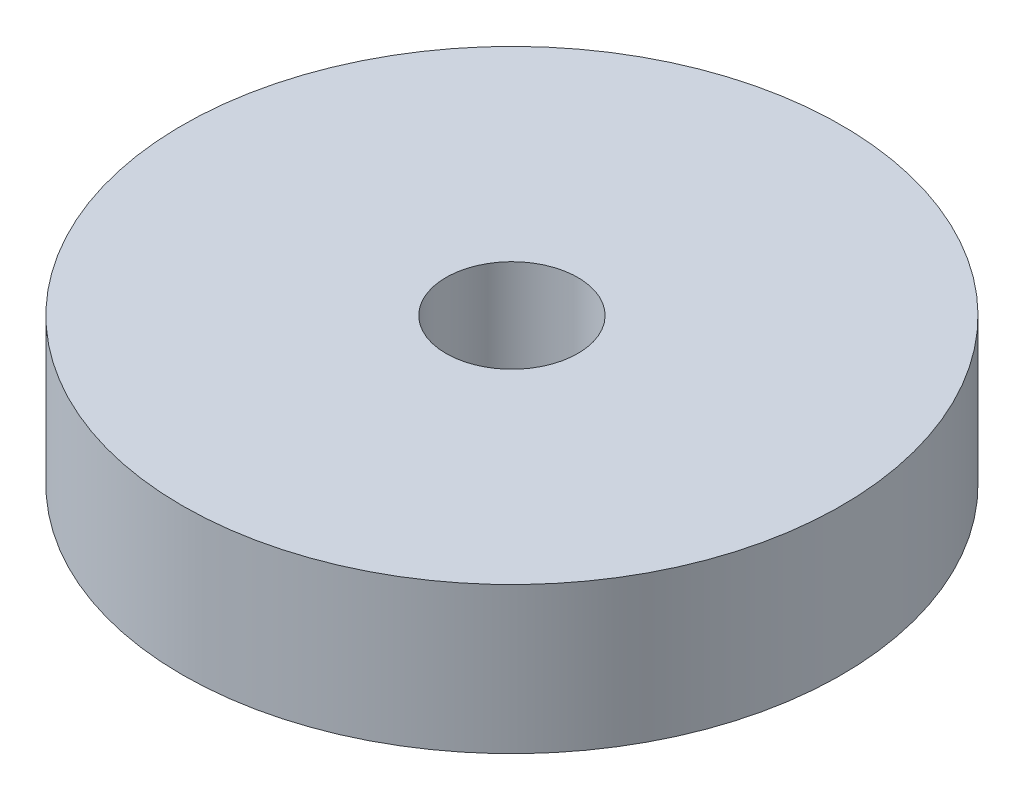
ISO-10303-21;
HEADER;
FILE_DESCRIPTION(('STEP AP214'),'2;1');
FILE_NAME('part.step','',(''),(''),'','','');
FILE_SCHEMA(('AUTOMOTIVE_DESIGN { 1 0 10303 214 1 1 1 1 }'));
ENDSEC;
DATA;
#1=APPLICATION_CONTEXT('core data for automotive mechanical design processes');
#2=APPLICATION_PROTOCOL_DEFINITION('international standard','automotive_design',2000,#1);
#3=PRODUCT_CONTEXT('',#1,'mechanical');
#4=PRODUCT('Part','Part','',(#3));
#5=PRODUCT_RELATED_PRODUCT_CATEGORY('part','',(#4));
#6=PRODUCT_DEFINITION_FORMATION('','',#4);
#7=PRODUCT_DEFINITION_CONTEXT('part definition',#1,'design');
#8=PRODUCT_DEFINITION('design','',#6,#7);
#9=PRODUCT_DEFINITION_SHAPE('','',#8);
#10=(LENGTH_UNIT() NAMED_UNIT(*) SI_UNIT(.MILLI.,.METRE.));
#11=(NAMED_UNIT(*) PLANE_ANGLE_UNIT() SI_UNIT($,.RADIAN.));
#12=(NAMED_UNIT(*) SI_UNIT($,.STERADIAN.) SOLID_ANGLE_UNIT());
#13=UNCERTAINTY_MEASURE_WITH_UNIT(LENGTH_MEASURE(1.E-05),#10,'distance_accuracy_value','');
#14=(GEOMETRIC_REPRESENTATION_CONTEXT(3) GLOBAL_UNCERTAINTY_ASSIGNED_CONTEXT((#13)) GLOBAL_UNIT_ASSIGNED_CONTEXT((#10,
#11,#12)) REPRESENTATION_CONTEXT('',''));
#15=CARTESIAN_POINT('',(0.,0.,0.));
#16=DIRECTION('',(0.,0.,1.));
#17=DIRECTION('',(1.,0.,0.));
#18=AXIS2_PLACEMENT_3D('',#15,#16,#17);
#19=CARTESIAN_POINT('',(78.0519363783236,2.,71.4526734962403));
#20=DIRECTION('',(0.,-1.,0.));
#21=DIRECTION('',(0.,0.,-1.));
#22=AXIS2_PLACEMENT_3D('',#19,#20,#21);
#23=CYLINDRICAL_SURFACE('',#22,4.50000000000001);
#24=CARTESIAN_POINT('',(78.0519363783236,2.,71.4526734962403));
#25=DIRECTION('',(0.,1.,0.));
#26=DIRECTION('',(0.,0.,1.));
#27=AXIS2_PLACEMENT_3D('',#24,#25,#26);
#28=CIRCLE('',#27,4.50000000000001);
#29=CARTESIAN_POINT('',(78.0519363783236,2.,75.9526734962403));
#30=VERTEX_POINT('',#29);
#31=EDGE_CURVE('E12',#30,#30,#28,.T.);
#32=ORIENTED_EDGE('',*,*,#31,.F.);
#33=EDGE_LOOP('',(#32));
#34=FACE_BOUND('',#33,.T.);
#35=CARTESIAN_POINT('',(78.0519363783236,0.,71.4526734962403));
#36=DIRECTION('',(0.,1.,0.));
#37=DIRECTION('',(0.,0.,1.));
#38=AXIS2_PLACEMENT_3D('',#35,#36,#37);
#39=CIRCLE('',#38,4.50000000000001);
#40=CARTESIAN_POINT('',(78.0519363783236,0.,75.9526734962403));
#41=VERTEX_POINT('',#40);
#42=EDGE_CURVE('E47',#41,#41,#39,.T.);
#43=ORIENTED_EDGE('',*,*,#42,.T.);
#44=EDGE_LOOP('',(#43));
#45=FACE_BOUND('',#44,.T.);
#46=ADVANCED_FACE('F44',(#34,#45),#23,.T.);
#47=CARTESIAN_POINT('',(78.0519363783236,2.,71.4526734962403));
#48=DIRECTION('',(0.,1.,0.));
#49=DIRECTION('',(0.,0.,1.));
#50=AXIS2_PLACEMENT_3D('',#47,#48,#49);
#51=PLANE('',#50);
#52=CARTESIAN_POINT('',(78.0519363783236,2.,71.4526734962403));
#53=DIRECTION('',(0.,1.,0.));
#54=DIRECTION('',(0.,0.,1.));
#55=AXIS2_PLACEMENT_3D('',#52,#53,#54);
#56=CIRCLE('',#55,0.900000000000003);
#57=CARTESIAN_POINT('',(78.0519363783236,2.,72.3526734962402));
#58=VERTEX_POINT('',#57);
#59=EDGE_CURVE('E56',#58,#58,#56,.T.);
#60=ORIENTED_EDGE('',*,*,#59,.F.);
#61=EDGE_LOOP('',(#60));
#62=FACE_BOUND('',#61,.T.);
#63=ORIENTED_EDGE('',*,*,#31,.T.);
#64=EDGE_LOOP('',(#63));
#65=FACE_BOUND('',#64,.T.);
#66=ADVANCED_FACE('F71',(#62,#65),#51,.T.);
#67=CARTESIAN_POINT('',(78.0519363783236,0.,71.4526734962403));
#68=DIRECTION('',(0.,1.,0.));
#69=DIRECTION('',(0.,0.,1.));
#70=AXIS2_PLACEMENT_3D('',#67,#68,#69);
#71=PLANE('',#70);
#72=CARTESIAN_POINT('',(78.0519363783236,0.,71.4526734962403));
#73=DIRECTION('',(0.,1.,0.));
#74=DIRECTION('',(0.,0.,1.));
#75=AXIS2_PLACEMENT_3D('',#72,#73,#74);
#76=CIRCLE('',#75,0.900000000000003);
#77=CARTESIAN_POINT('',(78.0519363783236,0.,72.3526734962402));
#78=VERTEX_POINT('',#77);
#79=EDGE_CURVE('E54',#78,#78,#76,.T.);
#80=ORIENTED_EDGE('',*,*,#79,.T.);
#81=EDGE_LOOP('',(#80));
#82=FACE_BOUND('',#81,.T.);
#83=ORIENTED_EDGE('',*,*,#42,.F.);
#84=EDGE_LOOP('',(#83));
#85=FACE_BOUND('',#84,.T.);
#86=ADVANCED_FACE('F62',(#82,#85),#71,.F.);
#87=CARTESIAN_POINT('',(78.0519363783236,0.,71.4526734962403));
#88=DIRECTION('',(0.,1.,0.));
#89=DIRECTION('',(0.,0.,1.));
#90=AXIS2_PLACEMENT_3D('',#87,#88,#89);
#91=CYLINDRICAL_SURFACE('',#90,0.900000000000003);
#92=ORIENTED_EDGE('',*,*,#79,.F.);
#93=EDGE_LOOP('',(#92));
#94=FACE_BOUND('',#93,.T.);
#95=ORIENTED_EDGE('',*,*,#59,.T.);
#96=EDGE_LOOP('',(#95));
#97=FACE_BOUND('',#96,.T.);
#98=ADVANCED_FACE('F65',(#94,#97),#91,.F.);
#99=CLOSED_SHELL('',(#46,#66,#86,#98));
#100=MANIFOLD_SOLID_BREP('B2',#99);
#101=ADVANCED_BREP_SHAPE_REPRESENTATION('',(#18,#100),#14);
#102=SHAPE_DEFINITION_REPRESENTATION(#9,#101);
ENDSEC;
END-ISO-10303-21;
